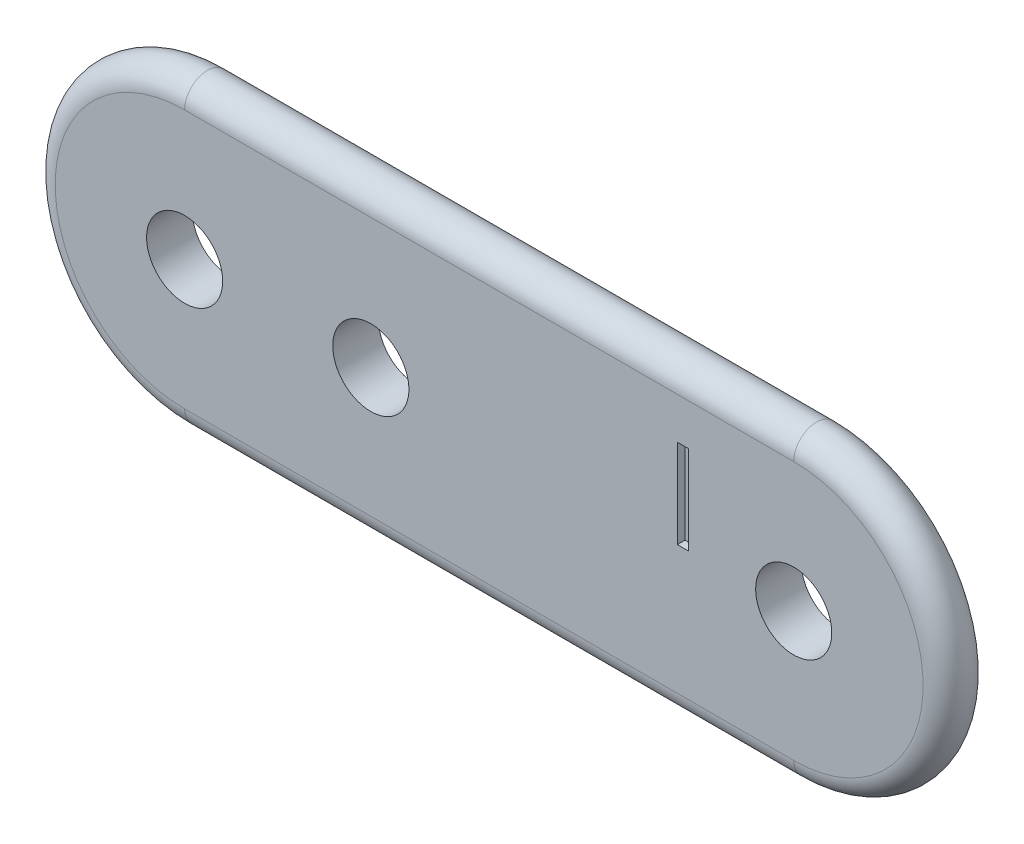
ISO-10303-21;
HEADER;
FILE_DESCRIPTION(('STEP AP214'),'2;1');
FILE_NAME('part.step','',(''),(''),'','','');
FILE_SCHEMA(('AUTOMOTIVE_DESIGN { 1 0 10303 214 1 1 1 1 }'));
ENDSEC;
DATA;
#1=APPLICATION_CONTEXT('core data for automotive mechanical design processes');
#2=APPLICATION_PROTOCOL_DEFINITION('international standard','automotive_design',2000,#1);
#3=PRODUCT_CONTEXT('',#1,'mechanical');
#4=PRODUCT('Part','Part','',(#3));
#5=PRODUCT_RELATED_PRODUCT_CATEGORY('part','',(#4));
#6=PRODUCT_DEFINITION_FORMATION('','',#4);
#7=PRODUCT_DEFINITION_CONTEXT('part definition',#1,'design');
#8=PRODUCT_DEFINITION('design','',#6,#7);
#9=PRODUCT_DEFINITION_SHAPE('','',#8);
#10=(LENGTH_UNIT() NAMED_UNIT(*) SI_UNIT(.MILLI.,.METRE.));
#11=(NAMED_UNIT(*) PLANE_ANGLE_UNIT() SI_UNIT($,.RADIAN.));
#12=(NAMED_UNIT(*) SI_UNIT($,.STERADIAN.) SOLID_ANGLE_UNIT());
#13=UNCERTAINTY_MEASURE_WITH_UNIT(LENGTH_MEASURE(1.E-05),#10,'distance_accuracy_value','');
#14=(GEOMETRIC_REPRESENTATION_CONTEXT(3) GLOBAL_UNCERTAINTY_ASSIGNED_CONTEXT((#13)) GLOBAL_UNIT_ASSIGNED_CONTEXT((#10,
#11,#12)) REPRESENTATION_CONTEXT('',''));
#15=CARTESIAN_POINT('',(0.,0.,0.));
#16=DIRECTION('',(0.,0.,1.));
#17=DIRECTION('',(1.,0.,0.));
#18=AXIS2_PLACEMENT_3D('',#15,#16,#17);
#19=CARTESIAN_POINT('',(-20.,0.0411989681822212,3.));
#20=DIRECTION('',(0.,0.,1.));
#21=DIRECTION('',(1.,0.,0.));
#22=AXIS2_PLACEMENT_3D('',#19,#20,#21);
#23=PLANE('',#22);
#24=CARTESIAN_POINT('',(-20.,0.0411989681822212,3.));
#25=DIRECTION('',(0.,0.,-1.));
#26=DIRECTION('',(-1.,0.,0.));
#27=AXIS2_PLACEMENT_3D('',#24,#25,#26);
#28=CIRCLE('',#27,2.49999999999998);
#29=CARTESIAN_POINT('',(-22.5,0.0411989681822212,3.));
#30=VERTEX_POINT('',#29);
#31=EDGE_CURVE('E370',#30,#30,#28,.T.);
#32=ORIENTED_EDGE('',*,*,#31,.T.);
#33=EDGE_LOOP('',(#32));
#34=FACE_BOUND('',#33,.T.);
#35=CARTESIAN_POINT('',(-7.77183563993397,0.,3.));
#36=DIRECTION('',(0.,0.,-1.));
#37=DIRECTION('',(-1.,0.,0.));
#38=AXIS2_PLACEMENT_3D('',#35,#36,#37);
#39=CIRCLE('',#38,2.49999999999999);
#40=CARTESIAN_POINT('',(-10.271835639934,0.,3.));
#41=VERTEX_POINT('',#40);
#42=EDGE_CURVE('E380',#41,#41,#39,.T.);
#43=ORIENTED_EDGE('',*,*,#42,.T.);
#44=EDGE_LOOP('',(#43));
#45=FACE_BOUND('',#44,.T.);
#46=CARTESIAN_POINT('',(20.,0.0411989681822212,3.));
#47=DIRECTION('',(0.,0.,-1.));
#48=DIRECTION('',(-1.,0.,0.));
#49=AXIS2_PLACEMENT_3D('',#46,#47,#48);
#50=CIRCLE('',#49,2.49999999999998);
#51=CARTESIAN_POINT('',(17.5,0.0411989681822212,3.));
#52=VERTEX_POINT('',#51);
#53=EDGE_CURVE('E136',#52,#52,#50,.T.);
#54=ORIENTED_EDGE('',*,*,#53,.T.);
#55=EDGE_LOOP('',(#54));
#56=FACE_BOUND('',#55,.T.);
#57=DIRECTION('',(-1.,0.,0.));
#58=VECTOR('',#57,1.);
#59=CARTESIAN_POINT('',(13.0998901672251,5.82237115465715,3.));
#60=LINE('',#59,#58);
#61=CARTESIAN_POINT('',(13.0998901672251,5.82237115465715,3.));
#62=VERTEX_POINT('',#61);
#63=CARTESIAN_POINT('',(12.361868185973,5.82237115465715,3.));
#64=VERTEX_POINT('',#63);
#65=EDGE_CURVE('E61',#62,#64,#60,.T.);
#66=ORIENTED_EDGE('',*,*,#65,.F.);
#67=DIRECTION('',(0.,1.,0.));
#68=VECTOR('',#67,1.);
#69=CARTESIAN_POINT('',(13.0998901672251,0.,3.));
#70=LINE('',#69,#68);
#71=CARTESIAN_POINT('',(13.0998901672251,0.,3.));
#72=VERTEX_POINT('',#71);
#73=EDGE_CURVE('E130',#72,#62,#70,.T.);
#74=ORIENTED_EDGE('',*,*,#73,.F.);
#75=DIRECTION('',(1.,0.,0.));
#76=VECTOR('',#75,1.);
#77=CARTESIAN_POINT('',(12.361868185973,0.,3.));
#78=LINE('',#77,#76);
#79=CARTESIAN_POINT('',(12.361868185973,0.,3.));
#80=VERTEX_POINT('',#79);
#81=EDGE_CURVE('E133',#80,#72,#78,.T.);
#82=ORIENTED_EDGE('',*,*,#81,.F.);
#83=DIRECTION('',(0.,-1.,0.));
#84=VECTOR('',#83,1.);
#85=CARTESIAN_POINT('',(12.361868185973,5.82237115465715,3.));
#86=LINE('',#85,#84);
#87=EDGE_CURVE('E142',#64,#80,#86,.T.);
#88=ORIENTED_EDGE('',*,*,#87,.F.);
#89=EDGE_LOOP('',(#66,#74,#82,#88));
#90=FACE_BOUND('',#89,.T.);
#91=DIRECTION('',(1.,0.,0.));
#92=VECTOR('',#91,1.);
#93=CARTESIAN_POINT('',(20.,-8.45880103181778,3.));
#94=LINE('',#93,#92);
#95=CARTESIAN_POINT('',(-20.,-8.45880103181778,3.));
#96=VERTEX_POINT('',#95);
#97=CARTESIAN_POINT('',(20.,-8.45880103181778,3.));
#98=VERTEX_POINT('',#97);
#99=EDGE_CURVE('E53',#96,#98,#94,.T.);
#100=ORIENTED_EDGE('',*,*,#99,.T.);
#101=CARTESIAN_POINT('',(20.,0.0411989681822212,3.));
#102=DIRECTION('',(0.,0.,1.));
#103=DIRECTION('',(1.,0.,0.));
#104=AXIS2_PLACEMENT_3D('',#101,#102,#103);
#105=CIRCLE('',#104,8.5);
#106=CARTESIAN_POINT('',(20.,8.54119896818222,3.));
#107=VERTEX_POINT('',#106);
#108=EDGE_CURVE('E12',#98,#107,#105,.T.);
#109=ORIENTED_EDGE('',*,*,#108,.T.);
#110=DIRECTION('',(-1.,0.,0.));
#111=VECTOR('',#110,1.);
#112=CARTESIAN_POINT('',(-20.,8.54119896818222,3.));
#113=LINE('',#112,#111);
#114=CARTESIAN_POINT('',(-20.,8.54119896818222,3.));
#115=VERTEX_POINT('',#114);
#116=EDGE_CURVE('E168',#107,#115,#113,.T.);
#117=ORIENTED_EDGE('',*,*,#116,.T.);
#118=CARTESIAN_POINT('',(-20.,0.0411989681822212,3.));
#119=DIRECTION('',(0.,0.,1.));
#120=DIRECTION('',(1.,0.,0.));
#121=AXIS2_PLACEMENT_3D('',#118,#119,#120);
#122=CIRCLE('',#121,8.5);
#123=EDGE_CURVE('E171',#115,#96,#122,.T.);
#124=ORIENTED_EDGE('',*,*,#123,.T.);
#125=EDGE_LOOP('',(#100,#109,#117,#124));
#126=FACE_BOUND('',#125,.T.);
#127=ADVANCED_FACE('F42',(#34,#45,#56,#90,#126),#23,.T.);
#128=CARTESIAN_POINT('',(-20.,0.0411989681822212,0.));
#129=DIRECTION('',(0.,0.,1.));
#130=DIRECTION('',(1.,0.,0.));
#131=AXIS2_PLACEMENT_3D('',#128,#129,#130);
#132=PLANE('',#131);
#133=CARTESIAN_POINT('',(-20.,0.0411989681822212,0.));
#134=DIRECTION('',(0.,0.,-1.));
#135=DIRECTION('',(-1.,0.,0.));
#136=AXIS2_PLACEMENT_3D('',#133,#134,#135);
#137=CIRCLE('',#136,2.49999999999998);
#138=CARTESIAN_POINT('',(-22.5,0.0411989681822212,0.));
#139=VERTEX_POINT('',#138);
#140=EDGE_CURVE('E373',#139,#139,#137,.T.);
#141=ORIENTED_EDGE('',*,*,#140,.F.);
#142=EDGE_LOOP('',(#141));
#143=FACE_BOUND('',#142,.T.);
#144=CARTESIAN_POINT('',(-7.77183563993397,0.,0.));
#145=DIRECTION('',(0.,0.,-1.));
#146=DIRECTION('',(-1.,0.,0.));
#147=AXIS2_PLACEMENT_3D('',#144,#145,#146);
#148=CIRCLE('',#147,2.49999999999999);
#149=CARTESIAN_POINT('',(-10.271835639934,0.,0.));
#150=VERTEX_POINT('',#149);
#151=EDGE_CURVE('E375',#150,#150,#148,.T.);
#152=ORIENTED_EDGE('',*,*,#151,.F.);
#153=EDGE_LOOP('',(#152));
#154=FACE_BOUND('',#153,.T.);
#155=CARTESIAN_POINT('',(20.,0.0411989681822212,0.));
#156=DIRECTION('',(0.,0.,-1.));
#157=DIRECTION('',(-1.,0.,0.));
#158=AXIS2_PLACEMENT_3D('',#155,#156,#157);
#159=CIRCLE('',#158,2.49999999999998);
#160=CARTESIAN_POINT('',(17.5,0.0411989681822212,0.));
#161=VERTEX_POINT('',#160);
#162=EDGE_CURVE('E382',#161,#161,#159,.T.);
#163=ORIENTED_EDGE('',*,*,#162,.F.);
#164=EDGE_LOOP('',(#163));
#165=FACE_BOUND('',#164,.T.);
#166=DIRECTION('',(-1.,0.,0.));
#167=VECTOR('',#166,1.);
#168=CARTESIAN_POINT('',(-20.,8.54119896818222,0.));
#169=LINE('',#168,#167);
#170=CARTESIAN_POINT('',(-20.,8.54119896818222,0.));
#171=VERTEX_POINT('',#170);
#172=CARTESIAN_POINT('',(20.,8.54119896818222,0.));
#173=VERTEX_POINT('',#172);
#174=EDGE_CURVE('E152',#171,#173,#169,.F.);
#175=ORIENTED_EDGE('',*,*,#174,.T.);
#176=CARTESIAN_POINT('',(20.,0.0411989681822212,0.));
#177=DIRECTION('',(0.,0.,1.));
#178=DIRECTION('',(1.,0.,0.));
#179=AXIS2_PLACEMENT_3D('',#176,#177,#178);
#180=CIRCLE('',#179,8.5);
#181=CARTESIAN_POINT('',(20.,-8.45880103181778,0.));
#182=VERTEX_POINT('',#181);
#183=EDGE_CURVE('E164',#173,#182,#180,.F.);
#184=ORIENTED_EDGE('',*,*,#183,.T.);
#185=DIRECTION('',(1.,0.,0.));
#186=VECTOR('',#185,1.);
#187=CARTESIAN_POINT('',(-20.,-8.45880103181778,0.));
#188=LINE('',#187,#186);
#189=CARTESIAN_POINT('',(-20.,-8.45880103181778,0.));
#190=VERTEX_POINT('',#189);
#191=EDGE_CURVE('E160',#182,#190,#188,.F.);
#192=ORIENTED_EDGE('',*,*,#191,.T.);
#193=CARTESIAN_POINT('',(-20.,0.0411989681822212,0.));
#194=DIRECTION('',(0.,0.,1.));
#195=DIRECTION('',(1.,0.,0.));
#196=AXIS2_PLACEMENT_3D('',#193,#194,#195);
#197=CIRCLE('',#196,8.5);
#198=EDGE_CURVE('E156',#190,#171,#197,.F.);
#199=ORIENTED_EDGE('',*,*,#198,.T.);
#200=EDGE_LOOP('',(#175,#184,#192,#199));
#201=FACE_BOUND('',#200,.T.);
#202=ADVANCED_FACE('F226',(#143,#154,#165,#201),#132,.F.);
#203=CARTESIAN_POINT('',(-20.,0.0411989681822212,1.5));
#204=DIRECTION('',(0.,0.,1.));
#205=DIRECTION('',(1.,0.,0.));
#206=AXIS2_PLACEMENT_3D('',#203,#204,#205);
#207=TOROIDAL_SURFACE('',#206,8.5,1.5);
#208=CARTESIAN_POINT('',(-20.,-8.45880103181778,1.5));
#209=DIRECTION('',(1.,0.,0.));
#210=DIRECTION('',(0.,0.,-1.));
#211=AXIS2_PLACEMENT_3D('',#208,#209,#210);
#212=CIRCLE('',#211,1.5);
#213=EDGE_CURVE('E46',#96,#190,#212,.T.);
#214=ORIENTED_EDGE('',*,*,#213,.F.);
#215=ORIENTED_EDGE('',*,*,#123,.F.);
#216=CARTESIAN_POINT('',(-20.,8.54119896818222,1.5));
#217=DIRECTION('',(1.,0.,0.));
#218=DIRECTION('',(0.,0.,-1.));
#219=AXIS2_PLACEMENT_3D('',#216,#217,#218);
#220=CIRCLE('',#219,1.5);
#221=EDGE_CURVE('E186',#171,#115,#220,.T.);
#222=ORIENTED_EDGE('',*,*,#221,.F.);
#223=ORIENTED_EDGE('',*,*,#198,.F.);
#224=EDGE_LOOP('',(#214,#215,#222,#223));
#225=FACE_BOUND('',#224,.T.);
#226=ADVANCED_FACE('F44',(#225),#207,.T.);
#227=CARTESIAN_POINT('',(-20.,-8.45880103181778,1.5));
#228=DIRECTION('',(-1.,0.,0.));
#229=DIRECTION('',(0.,0.,1.));
#230=AXIS2_PLACEMENT_3D('',#227,#228,#229);
#231=CYLINDRICAL_SURFACE('',#230,1.5);
#232=ORIENTED_EDGE('',*,*,#99,.F.);
#233=ORIENTED_EDGE('',*,*,#213,.T.);
#234=ORIENTED_EDGE('',*,*,#191,.F.);
#235=CARTESIAN_POINT('',(20.,-8.45880103181778,1.5));
#236=DIRECTION('',(1.,0.,0.));
#237=DIRECTION('',(0.,0.,-1.));
#238=AXIS2_PLACEMENT_3D('',#235,#236,#237);
#239=CIRCLE('',#238,1.5);
#240=EDGE_CURVE('E191',#98,#182,#239,.T.);
#241=ORIENTED_EDGE('',*,*,#240,.F.);
#242=EDGE_LOOP('',(#232,#233,#234,#241));
#243=FACE_BOUND('',#242,.T.);
#244=ADVANCED_FACE('F244',(#243),#231,.T.);
#245=CARTESIAN_POINT('',(-20.,8.54119896818222,1.5));
#246=DIRECTION('',(1.,0.,0.));
#247=DIRECTION('',(0.,0.,-1.));
#248=AXIS2_PLACEMENT_3D('',#245,#246,#247);
#249=CYLINDRICAL_SURFACE('',#248,1.5);
#250=ORIENTED_EDGE('',*,*,#221,.T.);
#251=ORIENTED_EDGE('',*,*,#116,.F.);
#252=CARTESIAN_POINT('',(20.,8.54119896818222,1.5));
#253=DIRECTION('',(1.,0.,0.));
#254=DIRECTION('',(0.,0.,-1.));
#255=AXIS2_PLACEMENT_3D('',#252,#253,#254);
#256=CIRCLE('',#255,1.5);
#257=EDGE_CURVE('E148',#173,#107,#256,.T.);
#258=ORIENTED_EDGE('',*,*,#257,.F.);
#259=ORIENTED_EDGE('',*,*,#174,.F.);
#260=EDGE_LOOP('',(#250,#251,#258,#259));
#261=FACE_BOUND('',#260,.T.);
#262=ADVANCED_FACE('F223',(#261),#249,.T.);
#263=CARTESIAN_POINT('',(20.,0.0411989681822212,1.5));
#264=DIRECTION('',(0.,0.,1.));
#265=DIRECTION('',(1.,0.,0.));
#266=AXIS2_PLACEMENT_3D('',#263,#264,#265);
#267=TOROIDAL_SURFACE('',#266,8.5,1.5);
#268=ORIENTED_EDGE('',*,*,#108,.F.);
#269=ORIENTED_EDGE('',*,*,#240,.T.);
#270=ORIENTED_EDGE('',*,*,#183,.F.);
#271=ORIENTED_EDGE('',*,*,#257,.T.);
#272=EDGE_LOOP('',(#268,#269,#270,#271));
#273=FACE_BOUND('',#272,.T.);
#274=ADVANCED_FACE('F220',(#273),#267,.T.);
#275=CARTESIAN_POINT('',(13.0998901672251,5.82237115465715,2.5));
#276=DIRECTION('',(0.,1.,0.));
#277=DIRECTION('',(0.,0.,1.));
#278=AXIS2_PLACEMENT_3D('',#275,#276,#277);
#279=PLANE('',#278);
#280=ORIENTED_EDGE('',*,*,#65,.T.);
#281=DIRECTION('',(0.,0.,1.));
#282=VECTOR('',#281,1.);
#283=CARTESIAN_POINT('',(12.361868185973,5.82237115465715,2.5));
#284=LINE('',#283,#282);
#285=CARTESIAN_POINT('',(12.361868185973,5.82237115465715,2.5));
#286=VERTEX_POINT('',#285);
#287=EDGE_CURVE('E108',#286,#64,#284,.T.);
#288=ORIENTED_EDGE('',*,*,#287,.F.);
#289=DIRECTION('',(-1.,0.,0.));
#290=VECTOR('',#289,1.);
#291=CARTESIAN_POINT('',(13.0998901672251,5.82237115465715,2.5));
#292=LINE('',#291,#290);
#293=CARTESIAN_POINT('',(13.0998901672251,5.82237115465715,2.5));
#294=VERTEX_POINT('',#293);
#295=EDGE_CURVE('E112',#294,#286,#292,.T.);
#296=ORIENTED_EDGE('',*,*,#295,.F.);
#297=DIRECTION('',(0.,0.,1.));
#298=VECTOR('',#297,1.);
#299=CARTESIAN_POINT('',(13.0998901672251,5.82237115465715,2.5));
#300=LINE('',#299,#298);
#301=EDGE_CURVE('E146',#294,#62,#300,.T.);
#302=ORIENTED_EDGE('',*,*,#301,.T.);
#303=EDGE_LOOP('',(#280,#288,#296,#302));
#304=FACE_BOUND('',#303,.T.);
#305=ADVANCED_FACE('F110',(#304),#279,.F.);
#306=CARTESIAN_POINT('',(13.0998901672251,0.,2.5));
#307=DIRECTION('',(1.,0.,0.));
#308=DIRECTION('',(0.,0.,-1.));
#309=AXIS2_PLACEMENT_3D('',#306,#307,#308);
#310=PLANE('',#309);
#311=ORIENTED_EDGE('',*,*,#73,.T.);
#312=ORIENTED_EDGE('',*,*,#301,.F.);
#313=DIRECTION('',(0.,1.,0.));
#314=VECTOR('',#313,1.);
#315=CARTESIAN_POINT('',(13.0998901672251,0.,2.5));
#316=LINE('',#315,#314);
#317=CARTESIAN_POINT('',(13.0998901672251,0.,2.5));
#318=VERTEX_POINT('',#317);
#319=EDGE_CURVE('E118',#318,#294,#316,.T.);
#320=ORIENTED_EDGE('',*,*,#319,.F.);
#321=DIRECTION('',(0.,0.,1.));
#322=VECTOR('',#321,1.);
#323=CARTESIAN_POINT('',(13.0998901672251,0.,2.5));
#324=LINE('',#323,#322);
#325=EDGE_CURVE('E149',#318,#72,#324,.T.);
#326=ORIENTED_EDGE('',*,*,#325,.T.);
#327=EDGE_LOOP('',(#311,#312,#320,#326));
#328=FACE_BOUND('',#327,.T.);
#329=ADVANCED_FACE('F335',(#328),#310,.F.);
#330=CARTESIAN_POINT('',(12.361868185973,0.,2.5));
#331=DIRECTION('',(0.,-1.,0.));
#332=DIRECTION('',(0.,0.,-1.));
#333=AXIS2_PLACEMENT_3D('',#330,#331,#332);
#334=PLANE('',#333);
#335=ORIENTED_EDGE('',*,*,#81,.T.);
#336=ORIENTED_EDGE('',*,*,#325,.F.);
#337=DIRECTION('',(1.,0.,0.));
#338=VECTOR('',#337,1.);
#339=CARTESIAN_POINT('',(12.361868185973,0.,2.5));
#340=LINE('',#339,#338);
#341=CARTESIAN_POINT('',(12.361868185973,0.,2.5));
#342=VERTEX_POINT('',#341);
#343=EDGE_CURVE('E126',#342,#318,#340,.T.);
#344=ORIENTED_EDGE('',*,*,#343,.F.);
#345=DIRECTION('',(0.,0.,1.));
#346=VECTOR('',#345,1.);
#347=CARTESIAN_POINT('',(12.361868185973,0.,2.5));
#348=LINE('',#347,#346);
#349=EDGE_CURVE('E117',#342,#80,#348,.T.);
#350=ORIENTED_EDGE('',*,*,#349,.T.);
#351=EDGE_LOOP('',(#335,#336,#344,#350));
#352=FACE_BOUND('',#351,.T.);
#353=ADVANCED_FACE('F327',(#352),#334,.F.);
#354=CARTESIAN_POINT('',(12.361868185973,5.82237115465715,2.5));
#355=DIRECTION('',(-1.,0.,0.));
#356=DIRECTION('',(0.,0.,1.));
#357=AXIS2_PLACEMENT_3D('',#354,#355,#356);
#358=PLANE('',#357);
#359=ORIENTED_EDGE('',*,*,#87,.T.);
#360=ORIENTED_EDGE('',*,*,#349,.F.);
#361=DIRECTION('',(0.,-1.,0.));
#362=VECTOR('',#361,1.);
#363=CARTESIAN_POINT('',(12.361868185973,5.82237115465715,2.5));
#364=LINE('',#363,#362);
#365=EDGE_CURVE('E121',#286,#342,#364,.T.);
#366=ORIENTED_EDGE('',*,*,#365,.F.);
#367=ORIENTED_EDGE('',*,*,#287,.T.);
#368=EDGE_LOOP('',(#359,#360,#366,#367));
#369=FACE_BOUND('',#368,.T.);
#370=ADVANCED_FACE('F122',(#369),#358,.F.);
#371=CARTESIAN_POINT('',(0.,0.,2.5));
#372=DIRECTION('',(0.,0.,1.));
#373=DIRECTION('',(1.,0.,0.));
#374=AXIS2_PLACEMENT_3D('',#371,#372,#373);
#375=PLANE('',#374);
#376=ORIENTED_EDGE('',*,*,#295,.T.);
#377=ORIENTED_EDGE('',*,*,#365,.T.);
#378=ORIENTED_EDGE('',*,*,#343,.T.);
#379=ORIENTED_EDGE('',*,*,#319,.T.);
#380=EDGE_LOOP('',(#376,#377,#378,#379));
#381=FACE_BOUND('',#380,.T.);
#382=ADVANCED_FACE('F128',(#381),#375,.T.);
#383=CARTESIAN_POINT('',(20.,0.0411989681822212,0.));
#384=DIRECTION('',(0.,0.,-1.));
#385=DIRECTION('',(-1.,0.,0.));
#386=AXIS2_PLACEMENT_3D('',#383,#384,#385);
#387=CYLINDRICAL_SURFACE('',#386,2.49999999999998);
#388=ORIENTED_EDGE('',*,*,#53,.F.);
#389=EDGE_LOOP('',(#388));
#390=FACE_BOUND('',#389,.T.);
#391=ORIENTED_EDGE('',*,*,#162,.T.);
#392=EDGE_LOOP('',(#391));
#393=FACE_BOUND('',#392,.T.);
#394=ADVANCED_FACE('F316',(#390,#393),#387,.F.);
#395=CARTESIAN_POINT('',(-7.77183563993397,0.,0.));
#396=DIRECTION('',(0.,0.,-1.));
#397=DIRECTION('',(-1.,0.,0.));
#398=AXIS2_PLACEMENT_3D('',#395,#396,#397);
#399=CYLINDRICAL_SURFACE('',#398,2.49999999999999);
#400=ORIENTED_EDGE('',*,*,#42,.F.);
#401=EDGE_LOOP('',(#400));
#402=FACE_BOUND('',#401,.T.);
#403=ORIENTED_EDGE('',*,*,#151,.T.);
#404=EDGE_LOOP('',(#403));
#405=FACE_BOUND('',#404,.T.);
#406=ADVANCED_FACE('F358',(#402,#405),#399,.F.);
#407=CARTESIAN_POINT('',(-20.,0.0411989681822212,0.));
#408=DIRECTION('',(0.,0.,-1.));
#409=DIRECTION('',(-1.,0.,0.));
#410=AXIS2_PLACEMENT_3D('',#407,#408,#409);
#411=CYLINDRICAL_SURFACE('',#410,2.49999999999998);
#412=ORIENTED_EDGE('',*,*,#31,.F.);
#413=EDGE_LOOP('',(#412));
#414=FACE_BOUND('',#413,.T.);
#415=ORIENTED_EDGE('',*,*,#140,.T.);
#416=EDGE_LOOP('',(#415));
#417=FACE_BOUND('',#416,.T.);
#418=ADVANCED_FACE('F362',(#414,#417),#411,.F.);
#419=CLOSED_SHELL('',(#127,#202,#226,#244,#262,#274,#305,#329,#353,#370,#382,#394,#406,#418));
#420=MANIFOLD_SOLID_BREP('B2',#419);
#421=ADVANCED_BREP_SHAPE_REPRESENTATION('',(#18,#420),#14);
#422=SHAPE_DEFINITION_REPRESENTATION(#9,#421);
ENDSEC;
END-ISO-10303-21;
